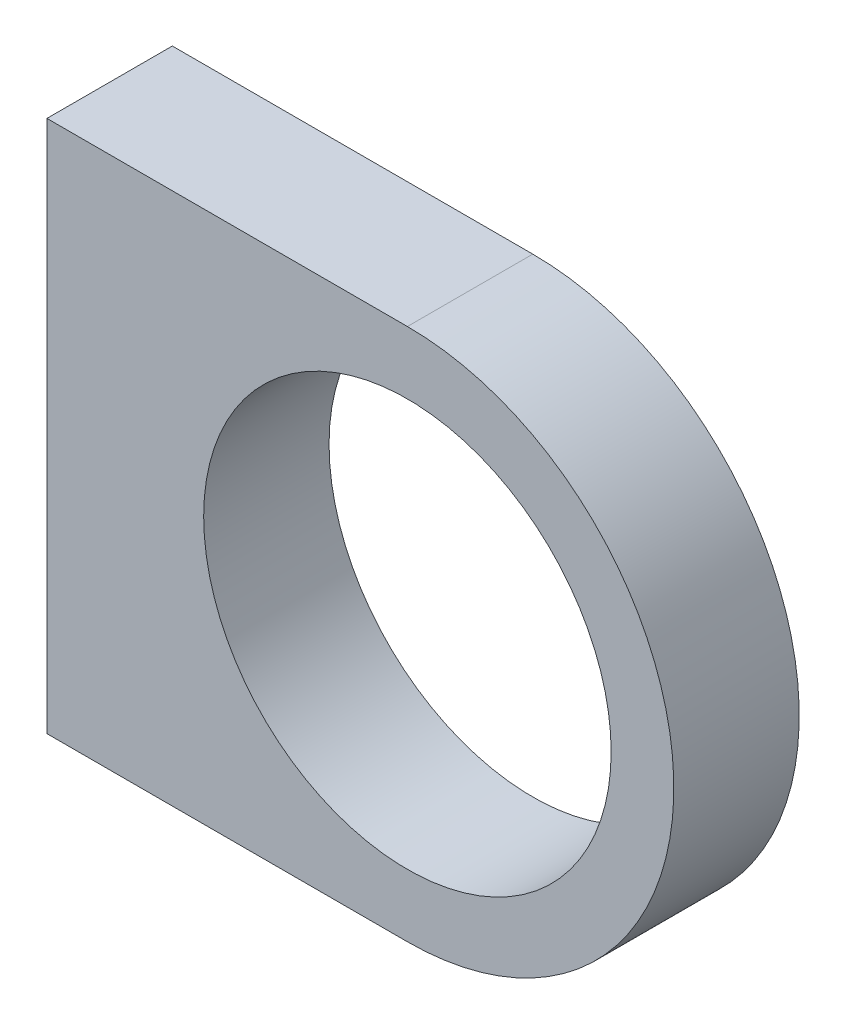
ISO-10303-21;
HEADER;
FILE_DESCRIPTION(('STEP AP214'),'2;1');
FILE_NAME('part.step','',(''),(''),'','','');
FILE_SCHEMA(('AUTOMOTIVE_DESIGN { 1 0 10303 214 1 1 1 1 }'));
ENDSEC;
DATA;
#1=APPLICATION_CONTEXT('core data for automotive mechanical design processes');
#2=APPLICATION_PROTOCOL_DEFINITION('international standard','automotive_design',2000,#1);
#3=PRODUCT_CONTEXT('',#1,'mechanical');
#4=PRODUCT('Part','Part','',(#3));
#5=PRODUCT_RELATED_PRODUCT_CATEGORY('part','',(#4));
#6=PRODUCT_DEFINITION_FORMATION('','',#4);
#7=PRODUCT_DEFINITION_CONTEXT('part definition',#1,'design');
#8=PRODUCT_DEFINITION('design','',#6,#7);
#9=PRODUCT_DEFINITION_SHAPE('','',#8);
#10=(LENGTH_UNIT() NAMED_UNIT(*) SI_UNIT(.MILLI.,.METRE.));
#11=(NAMED_UNIT(*) PLANE_ANGLE_UNIT() SI_UNIT($,.RADIAN.));
#12=(NAMED_UNIT(*) SI_UNIT($,.STERADIAN.) SOLID_ANGLE_UNIT());
#13=UNCERTAINTY_MEASURE_WITH_UNIT(LENGTH_MEASURE(1.E-05),#10,'distance_accuracy_value','');
#14=(GEOMETRIC_REPRESENTATION_CONTEXT(3) GLOBAL_UNCERTAINTY_ASSIGNED_CONTEXT((#13)) GLOBAL_UNIT_ASSIGNED_CONTEXT((#10,
#11,#12)) REPRESENTATION_CONTEXT('',''));
#15=CARTESIAN_POINT('',(0.,0.,0.));
#16=DIRECTION('',(0.,0.,1.));
#17=DIRECTION('',(1.,0.,0.));
#18=AXIS2_PLACEMENT_3D('',#15,#16,#17);
#19=CARTESIAN_POINT('',(22.9128784747792,-0.887716477004379,8.));
#20=DIRECTION('',(0.,0.,1.));
#21=DIRECTION('',(1.,0.,0.));
#22=AXIS2_PLACEMENT_3D('',#19,#20,#21);
#23=PLANE('',#22);
#24=CARTESIAN_POINT('',(22.9128784747792,-0.887716477004379,8.));
#25=DIRECTION('',(0.,0.,1.));
#26=DIRECTION('',(1.,0.,0.));
#27=AXIS2_PLACEMENT_3D('',#24,#25,#26);
#28=CIRCLE('',#27,17.);
#29=CARTESIAN_POINT('',(22.9128784747792,-17.8877164770044,8.));
#30=VERTEX_POINT('',#29);
#31=CARTESIAN_POINT('',(22.9128784747792,16.1122835229956,8.));
#32=VERTEX_POINT('',#31);
#33=EDGE_CURVE('E92',#30,#32,#28,.T.);
#34=ORIENTED_EDGE('',*,*,#33,.T.);
#35=DIRECTION('',(-1.,0.,0.));
#36=VECTOR('',#35,1.);
#37=CARTESIAN_POINT('',(22.9128784747792,16.1122835229956,8.));
#38=LINE('',#37,#36);
#39=CARTESIAN_POINT('',(-0.0871215252207999,16.1122835229956,8.));
#40=VERTEX_POINT('',#39);
#41=EDGE_CURVE('E87',#32,#40,#38,.T.);
#42=ORIENTED_EDGE('',*,*,#41,.T.);
#43=DIRECTION('',(0.,-1.,0.));
#44=VECTOR('',#43,1.);
#45=CARTESIAN_POINT('',(-0.0871215252207999,16.1122835229956,8.));
#46=LINE('',#45,#44);
#47=CARTESIAN_POINT('',(-0.087121525220793,-17.8877164770044,8.));
#48=VERTEX_POINT('',#47);
#49=EDGE_CURVE('E90',#40,#48,#46,.T.);
#50=ORIENTED_EDGE('',*,*,#49,.T.);
#51=DIRECTION('',(1.,0.,0.));
#52=VECTOR('',#51,1.);
#53=CARTESIAN_POINT('',(22.9128784747792,-17.8877164770044,8.));
#54=LINE('',#53,#52);
#55=EDGE_CURVE('E57',#48,#30,#54,.T.);
#56=ORIENTED_EDGE('',*,*,#55,.T.);
#57=EDGE_LOOP('',(#34,#42,#50,#56));
#58=FACE_BOUND('',#57,.T.);
#59=CARTESIAN_POINT('',(22.9128784747792,-0.887716477004379,8.));
#60=DIRECTION('',(0.,0.,1.));
#61=DIRECTION('',(1.,0.,0.));
#62=AXIS2_PLACEMENT_3D('',#59,#60,#61);
#63=CIRCLE('',#62,13.);
#64=CARTESIAN_POINT('',(35.9128784747792,-0.887716477004379,8.));
#65=VERTEX_POINT('',#64);
#66=EDGE_CURVE('E112',#65,#65,#63,.T.);
#67=ORIENTED_EDGE('',*,*,#66,.F.);
#68=EDGE_LOOP('',(#67));
#69=FACE_BOUND('',#68,.T.);
#70=ADVANCED_FACE('F39',(#58,#69),#23,.T.);
#71=CARTESIAN_POINT('',(22.9128784747792,-0.887716477004379,0.));
#72=DIRECTION('',(0.,0.,1.));
#73=DIRECTION('',(1.,0.,0.));
#74=AXIS2_PLACEMENT_3D('',#71,#72,#73);
#75=PLANE('',#74);
#76=CARTESIAN_POINT('',(22.9128784747792,-0.887716477004379,0.));
#77=DIRECTION('',(0.,0.,1.));
#78=DIRECTION('',(1.,0.,0.));
#79=AXIS2_PLACEMENT_3D('',#76,#77,#78);
#80=CIRCLE('',#79,17.);
#81=CARTESIAN_POINT('',(22.9128784747792,-17.8877164770044,0.));
#82=VERTEX_POINT('',#81);
#83=CARTESIAN_POINT('',(22.9128784747792,16.1122835229956,0.));
#84=VERTEX_POINT('',#83);
#85=EDGE_CURVE('E108',#82,#84,#80,.T.);
#86=ORIENTED_EDGE('',*,*,#85,.F.);
#87=DIRECTION('',(1.,0.,0.));
#88=VECTOR('',#87,1.);
#89=CARTESIAN_POINT('',(22.9128784747792,-17.8877164770044,0.));
#90=LINE('',#89,#88);
#91=CARTESIAN_POINT('',(-0.087121525220793,-17.8877164770044,0.));
#92=VERTEX_POINT('',#91);
#93=EDGE_CURVE('E80',#92,#82,#90,.T.);
#94=ORIENTED_EDGE('',*,*,#93,.F.);
#95=DIRECTION('',(0.,-1.,0.));
#96=VECTOR('',#95,1.);
#97=CARTESIAN_POINT('',(-0.0871215252207999,16.1122835229956,0.));
#98=LINE('',#97,#96);
#99=CARTESIAN_POINT('',(-0.0871215252207999,16.1122835229956,0.));
#100=VERTEX_POINT('',#99);
#101=EDGE_CURVE('E74',#100,#92,#98,.T.);
#102=ORIENTED_EDGE('',*,*,#101,.F.);
#103=DIRECTION('',(-1.,0.,0.));
#104=VECTOR('',#103,1.);
#105=CARTESIAN_POINT('',(22.9128784747792,16.1122835229956,0.));
#106=LINE('',#105,#104);
#107=EDGE_CURVE('E97',#84,#100,#106,.T.);
#108=ORIENTED_EDGE('',*,*,#107,.F.);
#109=EDGE_LOOP('',(#86,#94,#102,#108));
#110=FACE_BOUND('',#109,.T.);
#111=CARTESIAN_POINT('',(22.9128784747792,-0.887716477004379,0.));
#112=DIRECTION('',(0.,0.,1.));
#113=DIRECTION('',(1.,0.,0.));
#114=AXIS2_PLACEMENT_3D('',#111,#112,#113);
#115=CIRCLE('',#114,13.);
#116=CARTESIAN_POINT('',(35.9128784747792,-0.887716477004379,0.));
#117=VERTEX_POINT('',#116);
#118=EDGE_CURVE('E130',#117,#117,#115,.T.);
#119=ORIENTED_EDGE('',*,*,#118,.T.);
#120=EDGE_LOOP('',(#119));
#121=FACE_BOUND('',#120,.T.);
#122=ADVANCED_FACE('F125',(#110,#121),#75,.F.);
#123=CARTESIAN_POINT('',(22.9128784747792,-0.887716477004379,8.));
#124=DIRECTION('',(0.,0.,-1.));
#125=DIRECTION('',(-1.,0.,0.));
#126=AXIS2_PLACEMENT_3D('',#123,#124,#125);
#127=CYLINDRICAL_SURFACE('',#126,17.);
#128=ORIENTED_EDGE('',*,*,#85,.T.);
#129=DIRECTION('',(0.,0.,-1.));
#130=VECTOR('',#129,1.);
#131=CARTESIAN_POINT('',(22.9128784747792,16.1122835229956,8.));
#132=LINE('',#131,#130);
#133=EDGE_CURVE('E11',#32,#84,#132,.T.);
#134=ORIENTED_EDGE('',*,*,#133,.F.);
#135=ORIENTED_EDGE('',*,*,#33,.F.);
#136=DIRECTION('',(0.,0.,-1.));
#137=VECTOR('',#136,1.);
#138=CARTESIAN_POINT('',(22.9128784747792,-17.8877164770044,8.));
#139=LINE('',#138,#137);
#140=EDGE_CURVE('E104',#30,#82,#139,.T.);
#141=ORIENTED_EDGE('',*,*,#140,.T.);
#142=EDGE_LOOP('',(#128,#134,#135,#141));
#143=FACE_BOUND('',#142,.T.);
#144=ADVANCED_FACE('F41',(#143),#127,.T.);
#145=CARTESIAN_POINT('',(22.9128784747792,16.1122835229956,8.));
#146=DIRECTION('',(0.,-1.,0.));
#147=DIRECTION('',(0.,0.,-1.));
#148=AXIS2_PLACEMENT_3D('',#145,#146,#147);
#149=PLANE('',#148);
#150=ORIENTED_EDGE('',*,*,#107,.T.);
#151=DIRECTION('',(0.,0.,-1.));
#152=VECTOR('',#151,1.);
#153=CARTESIAN_POINT('',(-0.0871215252207999,16.1122835229956,8.));
#154=LINE('',#153,#152);
#155=EDGE_CURVE('E49',#40,#100,#154,.T.);
#156=ORIENTED_EDGE('',*,*,#155,.F.);
#157=ORIENTED_EDGE('',*,*,#41,.F.);
#158=ORIENTED_EDGE('',*,*,#133,.T.);
#159=EDGE_LOOP('',(#150,#156,#157,#158));
#160=FACE_BOUND('',#159,.T.);
#161=ADVANCED_FACE('F96',(#160),#149,.F.);
#162=CARTESIAN_POINT('',(-0.0871215252207999,16.1122835229956,8.));
#163=DIRECTION('',(1.,0.,0.));
#164=DIRECTION('',(0.,1.,0.));
#165=AXIS2_PLACEMENT_3D('',#162,#163,#164);
#166=PLANE('',#165);
#167=ORIENTED_EDGE('',*,*,#101,.T.);
#168=DIRECTION('',(0.,0.,-1.));
#169=VECTOR('',#168,1.);
#170=CARTESIAN_POINT('',(-0.087121525220793,-17.8877164770044,8.));
#171=LINE('',#170,#169);
#172=EDGE_CURVE('E99',#48,#92,#171,.T.);
#173=ORIENTED_EDGE('',*,*,#172,.F.);
#174=ORIENTED_EDGE('',*,*,#49,.F.);
#175=ORIENTED_EDGE('',*,*,#155,.T.);
#176=EDGE_LOOP('',(#167,#173,#174,#175));
#177=FACE_BOUND('',#176,.T.);
#178=ADVANCED_FACE('F100',(#177),#166,.F.);
#179=CARTESIAN_POINT('',(22.9128784747792,-17.8877164770044,8.));
#180=DIRECTION('',(0.,1.,0.));
#181=DIRECTION('',(-1.,0.,0.));
#182=AXIS2_PLACEMENT_3D('',#179,#180,#181);
#183=PLANE('',#182);
#184=ORIENTED_EDGE('',*,*,#93,.T.);
#185=ORIENTED_EDGE('',*,*,#140,.F.);
#186=ORIENTED_EDGE('',*,*,#55,.F.);
#187=ORIENTED_EDGE('',*,*,#172,.T.);
#188=EDGE_LOOP('',(#184,#185,#186,#187));
#189=FACE_BOUND('',#188,.T.);
#190=ADVANCED_FACE('F122',(#189),#183,.F.);
#191=CARTESIAN_POINT('',(22.9128784747792,-0.887716477004379,8.));
#192=DIRECTION('',(0.,0.,-1.));
#193=DIRECTION('',(-1.,0.,0.));
#194=AXIS2_PLACEMENT_3D('',#191,#192,#193);
#195=CYLINDRICAL_SURFACE('',#194,13.);
#196=ORIENTED_EDGE('',*,*,#66,.T.);
#197=EDGE_LOOP('',(#196));
#198=FACE_BOUND('',#197,.T.);
#199=ORIENTED_EDGE('',*,*,#118,.F.);
#200=EDGE_LOOP('',(#199));
#201=FACE_BOUND('',#200,.T.);
#202=ADVANCED_FACE('F138',(#198,#201),#195,.F.);
#203=CLOSED_SHELL('',(#70,#122,#144,#161,#178,#190,#202));
#204=MANIFOLD_SOLID_BREP('B2',#203);
#205=ADVANCED_BREP_SHAPE_REPRESENTATION('',(#18,#204),#14);
#206=SHAPE_DEFINITION_REPRESENTATION(#9,#205);
ENDSEC;
END-ISO-10303-21;
